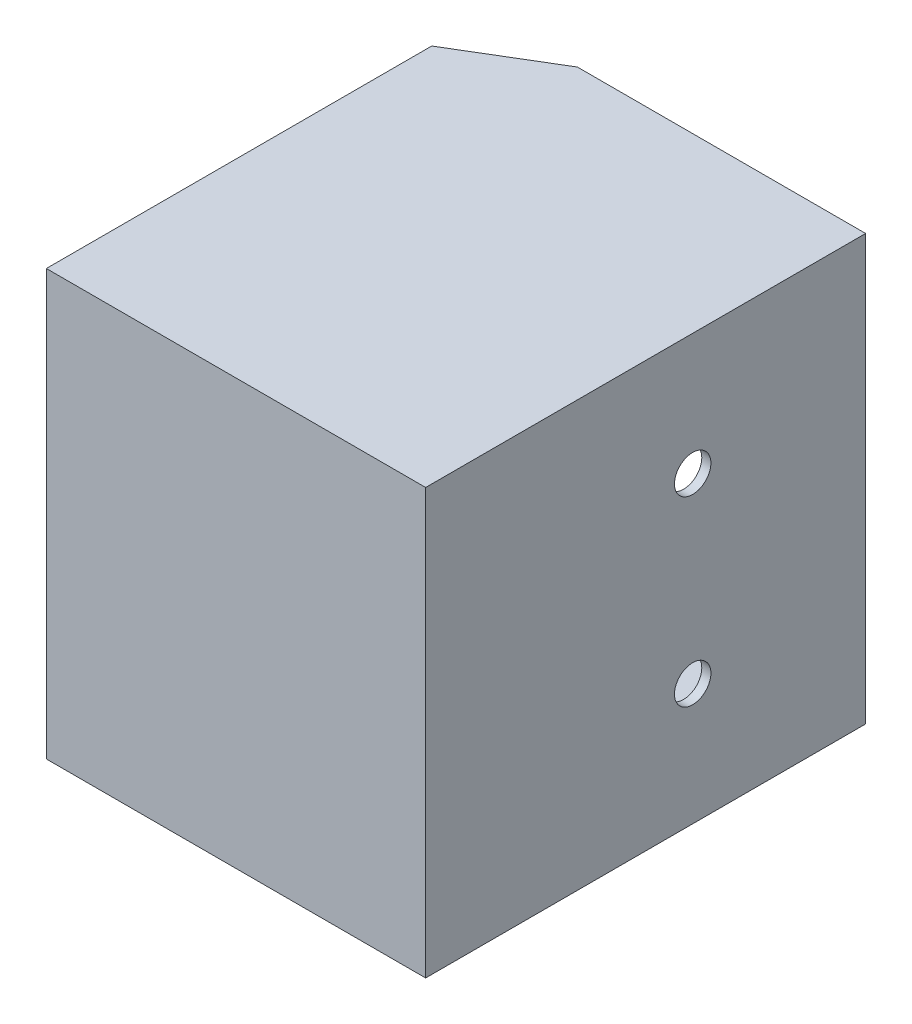
ISO-10303-21;
HEADER;
FILE_DESCRIPTION(('STEP AP214'),'2;1');
FILE_NAME('part.step','',(''),(''),'','','');
FILE_SCHEMA(('AUTOMOTIVE_DESIGN { 1 0 10303 214 1 1 1 1 }'));
ENDSEC;
DATA;
#1=APPLICATION_CONTEXT('core data for automotive mechanical design processes');
#2=APPLICATION_PROTOCOL_DEFINITION('international standard','automotive_design',2000,#1);
#3=PRODUCT_CONTEXT('',#1,'mechanical');
#4=PRODUCT('Part','Part','',(#3));
#5=PRODUCT_RELATED_PRODUCT_CATEGORY('part','',(#4));
#6=PRODUCT_DEFINITION_FORMATION('','',#4);
#7=PRODUCT_DEFINITION_CONTEXT('part definition',#1,'design');
#8=PRODUCT_DEFINITION('design','',#6,#7);
#9=PRODUCT_DEFINITION_SHAPE('','',#8);
#10=(LENGTH_UNIT() NAMED_UNIT(*) SI_UNIT(.MILLI.,.METRE.));
#11=(NAMED_UNIT(*) PLANE_ANGLE_UNIT() SI_UNIT($,.RADIAN.));
#12=(NAMED_UNIT(*) SI_UNIT($,.STERADIAN.) SOLID_ANGLE_UNIT());
#13=UNCERTAINTY_MEASURE_WITH_UNIT(LENGTH_MEASURE(1.E-05),#10,'distance_accuracy_value','');
#14=(GEOMETRIC_REPRESENTATION_CONTEXT(3) GLOBAL_UNCERTAINTY_ASSIGNED_CONTEXT((#13)) GLOBAL_UNIT_ASSIGNED_CONTEXT((#10,
#11,#12)) REPRESENTATION_CONTEXT('',''));
#15=CARTESIAN_POINT('',(0.,0.,0.));
#16=DIRECTION('',(0.,0.,1.));
#17=DIRECTION('',(1.,0.,0.));
#18=AXIS2_PLACEMENT_3D('',#15,#16,#17);
#19=CARTESIAN_POINT('',(0.,0.,127.));
#20=DIRECTION('',(0.,0.,1.));
#21=DIRECTION('',(1.,0.,0.));
#22=AXIS2_PLACEMENT_3D('',#19,#20,#21);
#23=PLANE('',#22);
#24=DIRECTION('',(1.,0.,0.));
#25=VECTOR('',#24,1.);
#26=CARTESIAN_POINT('',(0.,-67.,127.));
#27=LINE('',#26,#25);
#28=CARTESIAN_POINT('',(-52.,-67.,127.));
#29=VERTEX_POINT('',#28);
#30=CARTESIAN_POINT('',(67.,-67.,127.));
#31=VERTEX_POINT('',#30);
#32=EDGE_CURVE('E197',#29,#31,#27,.T.);
#33=ORIENTED_EDGE('',*,*,#32,.F.);
#34=DIRECTION('',(0.,1.,0.));
#35=VECTOR('',#34,1.);
#36=CARTESIAN_POINT('',(-52.,0.,127.));
#37=LINE('',#36,#35);
#38=CARTESIAN_POINT('',(-52.,67.,127.));
#39=VERTEX_POINT('',#38);
#40=EDGE_CURVE('E275',#29,#39,#37,.T.);
#41=ORIENTED_EDGE('',*,*,#40,.T.);
#42=DIRECTION('',(1.,0.,0.));
#43=VECTOR('',#42,1.);
#44=CARTESIAN_POINT('',(0.,67.,127.));
#45=LINE('',#44,#43);
#46=CARTESIAN_POINT('',(67.,67.,127.));
#47=VERTEX_POINT('',#46);
#48=EDGE_CURVE('E218',#39,#47,#45,.T.);
#49=ORIENTED_EDGE('',*,*,#48,.T.);
#50=DIRECTION('',(0.,-1.,0.));
#51=VECTOR('',#50,1.);
#52=CARTESIAN_POINT('',(67.,0.,127.));
#53=LINE('',#52,#51);
#54=EDGE_CURVE('E267',#47,#31,#53,.T.);
#55=ORIENTED_EDGE('',*,*,#54,.T.);
#56=EDGE_LOOP('',(#33,#41,#49,#55));
#57=FACE_BOUND('',#56,.T.);
#58=DIRECTION('',(0.,1.,0.));
#59=VECTOR('',#58,1.);
#60=CARTESIAN_POINT('',(-20.,0.,127.));
#61=LINE('',#60,#59);
#62=CARTESIAN_POINT('',(-20.,20.5,127.));
#63=VERTEX_POINT('',#62);
#64=CARTESIAN_POINT('',(-20.,24.5,127.));
#65=VERTEX_POINT('',#64);
#66=EDGE_CURVE('E59',#63,#65,#61,.T.);
#67=ORIENTED_EDGE('',*,*,#66,.F.);
#68=DIRECTION('',(1.,0.,0.));
#69=VECTOR('',#68,1.);
#70=CARTESIAN_POINT('',(0.,20.5,127.));
#71=LINE('',#70,#69);
#72=CARTESIAN_POINT('',(40.,20.5,127.));
#73=VERTEX_POINT('',#72);
#74=EDGE_CURVE('E180',#63,#73,#71,.T.);
#75=ORIENTED_EDGE('',*,*,#74,.T.);
#76=DIRECTION('',(0.,-1.,0.));
#77=VECTOR('',#76,1.);
#78=CARTESIAN_POINT('',(40.,0.,127.));
#79=LINE('',#78,#77);
#80=CARTESIAN_POINT('',(40.,24.5,127.));
#81=VERTEX_POINT('',#80);
#82=EDGE_CURVE('E161',#81,#73,#79,.T.);
#83=ORIENTED_EDGE('',*,*,#82,.F.);
#84=DIRECTION('',(1.,0.,0.));
#85=VECTOR('',#84,1.);
#86=CARTESIAN_POINT('',(0.,24.5,127.));
#87=LINE('',#86,#85);
#88=EDGE_CURVE('E53',#65,#81,#87,.T.);
#89=ORIENTED_EDGE('',*,*,#88,.F.);
#90=EDGE_LOOP('',(#67,#75,#83,#89));
#91=FACE_BOUND('',#90,.T.);
#92=ADVANCED_FACE('F39',(#57,#91),#23,.F.);
#93=CARTESIAN_POINT('',(67.,0.,0.));
#94=DIRECTION('',(1.,0.,0.));
#95=DIRECTION('',(0.,0.,-1.));
#96=AXIS2_PLACEMENT_3D('',#93,#94,#95);
#97=PLANE('',#96);
#98=CARTESIAN_POINT('',(67.,30.,42.));
#99=DIRECTION('',(1.,0.,0.));
#100=DIRECTION('',(0.,0.,-1.));
#101=AXIS2_PLACEMENT_3D('',#98,#99,#100);
#102=CIRCLE('',#101,6.);
#103=CARTESIAN_POINT('',(67.,30.,36.));
#104=VERTEX_POINT('',#103);
#105=EDGE_CURVE('E245',#104,#104,#102,.T.);
#106=ORIENTED_EDGE('',*,*,#105,.T.);
#107=EDGE_LOOP('',(#106));
#108=FACE_BOUND('',#107,.T.);
#109=CARTESIAN_POINT('',(67.,-30.,42.));
#110=DIRECTION('',(1.,0.,0.));
#111=DIRECTION('',(0.,0.,-1.));
#112=AXIS2_PLACEMENT_3D('',#109,#110,#111);
#113=CIRCLE('',#112,6.);
#114=CARTESIAN_POINT('',(67.,-30.,36.));
#115=VERTEX_POINT('',#114);
#116=EDGE_CURVE('E236',#115,#115,#113,.T.);
#117=ORIENTED_EDGE('',*,*,#116,.T.);
#118=EDGE_LOOP('',(#117));
#119=FACE_BOUND('',#118,.T.);
#120=DIRECTION('',(0.,0.,-1.));
#121=VECTOR('',#120,1.);
#122=CARTESIAN_POINT('',(67.,-67.,0.));
#123=LINE('',#122,#121);
#124=CARTESIAN_POINT('',(67.,-67.,-15.));
#125=VERTEX_POINT('',#124);
#126=EDGE_CURVE('E199',#31,#125,#123,.T.);
#127=ORIENTED_EDGE('',*,*,#126,.F.);
#128=ORIENTED_EDGE('',*,*,#54,.F.);
#129=DIRECTION('',(0.,0.,-1.));
#130=VECTOR('',#129,1.);
#131=CARTESIAN_POINT('',(67.,67.,0.));
#132=LINE('',#131,#130);
#133=CARTESIAN_POINT('',(67.,67.,-15.));
#134=VERTEX_POINT('',#133);
#135=EDGE_CURVE('E225',#47,#134,#132,.T.);
#136=ORIENTED_EDGE('',*,*,#135,.T.);
#137=DIRECTION('',(0.,1.,0.));
#138=VECTOR('',#137,1.);
#139=CARTESIAN_POINT('',(67.,-70.,-15.));
#140=LINE('',#139,#138);
#141=EDGE_CURVE('E249',#125,#134,#140,.T.);
#142=ORIENTED_EDGE('',*,*,#141,.F.);
#143=EDGE_LOOP('',(#127,#128,#136,#142));
#144=FACE_BOUND('',#143,.T.);
#145=ADVANCED_FACE('F307',(#108,#119,#144),#97,.F.);
#146=CARTESIAN_POINT('',(-52.,0.,0.));
#147=DIRECTION('',(1.,0.,0.));
#148=DIRECTION('',(0.,0.,-1.));
#149=AXIS2_PLACEMENT_3D('',#146,#147,#148);
#150=PLANE('',#149);
#151=ORIENTED_EDGE('',*,*,#40,.F.);
#152=DIRECTION('',(0.,0.,-1.));
#153=VECTOR('',#152,1.);
#154=CARTESIAN_POINT('',(-52.,-67.,0.));
#155=LINE('',#154,#153);
#156=CARTESIAN_POINT('',(-52.,-67.,3.));
#157=VERTEX_POINT('',#156);
#158=EDGE_CURVE('E193',#29,#157,#155,.T.);
#159=ORIENTED_EDGE('',*,*,#158,.T.);
#160=DIRECTION('',(0.,1.,0.));
#161=VECTOR('',#160,1.);
#162=CARTESIAN_POINT('',(-52.,-70.,3.));
#163=LINE('',#162,#161);
#164=CARTESIAN_POINT('',(-52.,67.,3.));
#165=VERTEX_POINT('',#164);
#166=EDGE_CURVE('E226',#157,#165,#163,.T.);
#167=ORIENTED_EDGE('',*,*,#166,.T.);
#168=DIRECTION('',(0.,0.,-1.));
#169=VECTOR('',#168,1.);
#170=CARTESIAN_POINT('',(-52.,67.,0.));
#171=LINE('',#170,#169);
#172=EDGE_CURVE('E216',#39,#165,#171,.T.);
#173=ORIENTED_EDGE('',*,*,#172,.F.);
#174=EDGE_LOOP('',(#151,#159,#167,#173));
#175=FACE_BOUND('',#174,.T.);
#176=ADVANCED_FACE('F314',(#175),#150,.T.);
#177=CARTESIAN_POINT('',(-52.,-70.,3.));
#178=DIRECTION('',(0.,0.,1.));
#179=DIRECTION('',(1.,0.,0.));
#180=AXIS2_PLACEMENT_3D('',#177,#178,#179);
#181=PLANE('',#180);
#182=DIRECTION('',(1.,0.,0.));
#183=VECTOR('',#182,1.);
#184=CARTESIAN_POINT('',(-52.,-67.,3.));
#185=LINE('',#184,#183);
#186=CARTESIAN_POINT('',(-55.,-67.,3.));
#187=VERTEX_POINT('',#186);
#188=EDGE_CURVE('E11',#187,#157,#185,.T.);
#189=ORIENTED_EDGE('',*,*,#188,.F.);
#190=DIRECTION('',(0.,1.,0.));
#191=VECTOR('',#190,1.);
#192=CARTESIAN_POINT('',(-55.,-70.,3.));
#193=LINE('',#192,#191);
#194=CARTESIAN_POINT('',(-55.,67.,3.));
#195=VERTEX_POINT('',#194);
#196=EDGE_CURVE('E223',#187,#195,#193,.T.);
#197=ORIENTED_EDGE('',*,*,#196,.T.);
#198=DIRECTION('',(1.,0.,0.));
#199=VECTOR('',#198,1.);
#200=CARTESIAN_POINT('',(-52.,67.,3.));
#201=LINE('',#200,#199);
#202=EDGE_CURVE('E50',#195,#165,#201,.T.);
#203=ORIENTED_EDGE('',*,*,#202,.T.);
#204=ORIENTED_EDGE('',*,*,#166,.F.);
#205=EDGE_LOOP('',(#189,#197,#203,#204));
#206=FACE_BOUND('',#205,.T.);
#207=ADVANCED_FACE('F277',(#206),#181,.F.);
#208=CARTESIAN_POINT('',(70.,0.,0.));
#209=DIRECTION('',(1.,0.,0.));
#210=DIRECTION('',(0.,0.,-1.));
#211=AXIS2_PLACEMENT_3D('',#208,#209,#210);
#212=PLANE('',#211);
#213=DIRECTION('',(0.,1.,0.));
#214=VECTOR('',#213,1.);
#215=CARTESIAN_POINT('',(70.,-70.,-15.));
#216=LINE('',#215,#214);
#217=CARTESIAN_POINT('',(70.,-70.,-15.));
#218=VERTEX_POINT('',#217);
#219=CARTESIAN_POINT('',(70.,70.,-15.));
#220=VERTEX_POINT('',#219);
#221=EDGE_CURVE('E251',#218,#220,#216,.T.);
#222=ORIENTED_EDGE('',*,*,#221,.T.);
#223=DIRECTION('',(0.,0.,1.));
#224=VECTOR('',#223,1.);
#225=CARTESIAN_POINT('',(70.,70.,-15.));
#226=LINE('',#225,#224);
#227=CARTESIAN_POINT('',(70.,70.,130.));
#228=VERTEX_POINT('',#227);
#229=EDGE_CURVE('E254',#220,#228,#226,.T.);
#230=ORIENTED_EDGE('',*,*,#229,.T.);
#231=DIRECTION('',(0.,-1.,0.));
#232=VECTOR('',#231,1.);
#233=CARTESIAN_POINT('',(70.,70.,130.));
#234=LINE('',#233,#232);
#235=CARTESIAN_POINT('',(70.,-70.,130.));
#236=VERTEX_POINT('',#235);
#237=EDGE_CURVE('E260',#228,#236,#234,.T.);
#238=ORIENTED_EDGE('',*,*,#237,.T.);
#239=DIRECTION('',(0.,0.,-1.));
#240=VECTOR('',#239,1.);
#241=CARTESIAN_POINT('',(70.,-70.,130.));
#242=LINE('',#241,#240);
#243=EDGE_CURVE('E253',#236,#218,#242,.T.);
#244=ORIENTED_EDGE('',*,*,#243,.T.);
#245=EDGE_LOOP('',(#222,#230,#238,#244));
#246=FACE_BOUND('',#245,.T.);
#247=CARTESIAN_POINT('',(70.,30.,42.));
#248=DIRECTION('',(1.,0.,0.));
#249=DIRECTION('',(0.,0.,-1.));
#250=AXIS2_PLACEMENT_3D('',#247,#248,#249);
#251=CIRCLE('',#250,6.);
#252=CARTESIAN_POINT('',(70.,30.,36.));
#253=VERTEX_POINT('',#252);
#254=EDGE_CURVE('E244',#253,#253,#251,.T.);
#255=ORIENTED_EDGE('',*,*,#254,.F.);
#256=EDGE_LOOP('',(#255));
#257=FACE_BOUND('',#256,.T.);
#258=CARTESIAN_POINT('',(70.,-30.,42.));
#259=DIRECTION('',(1.,0.,0.));
#260=DIRECTION('',(0.,0.,-1.));
#261=AXIS2_PLACEMENT_3D('',#258,#259,#260);
#262=CIRCLE('',#261,6.);
#263=CARTESIAN_POINT('',(70.,-30.,36.));
#264=VERTEX_POINT('',#263);
#265=EDGE_CURVE('E239',#264,#264,#262,.T.);
#266=ORIENTED_EDGE('',*,*,#265,.F.);
#267=EDGE_LOOP('',(#266));
#268=FACE_BOUND('',#267,.T.);
#269=ADVANCED_FACE('F321',(#246,#257,#268),#212,.T.);
#270=CARTESIAN_POINT('',(70.,-70.,130.));
#271=DIRECTION('',(0.,1.,0.));
#272=DIRECTION('',(0.,0.,1.));
#273=AXIS2_PLACEMENT_3D('',#270,#271,#272);
#274=PLANE('',#273);
#275=DIRECTION('',(0.,0.,-1.));
#276=VECTOR('',#275,1.);
#277=CARTESIAN_POINT('',(-55.,-70.,130.));
#278=LINE('',#277,#276);
#279=CARTESIAN_POINT('',(-55.,-70.,130.));
#280=VERTEX_POINT('',#279);
#281=CARTESIAN_POINT('',(-55.,-70.,3.));
#282=VERTEX_POINT('',#281);
#283=EDGE_CURVE('E237',#280,#282,#278,.T.);
#284=ORIENTED_EDGE('',*,*,#283,.T.);
#285=DIRECTION('',(-0.857492925712544,0.,0.514495755427526));
#286=VECTOR('',#285,1.);
#287=CARTESIAN_POINT('',(-55.,-70.,3.));
#288=LINE('',#287,#286);
#289=CARTESIAN_POINT('',(-25.,-70.,-15.));
#290=VERTEX_POINT('',#289);
#291=EDGE_CURVE('E181',#290,#282,#288,.T.);
#292=ORIENTED_EDGE('',*,*,#291,.F.);
#293=DIRECTION('',(-1.,0.,0.));
#294=VECTOR('',#293,1.);
#295=CARTESIAN_POINT('',(70.,-70.,-15.));
#296=LINE('',#295,#294);
#297=EDGE_CURVE('E270',#218,#290,#296,.T.);
#298=ORIENTED_EDGE('',*,*,#297,.F.);
#299=ORIENTED_EDGE('',*,*,#243,.F.);
#300=DIRECTION('',(-1.,0.,0.));
#301=VECTOR('',#300,1.);
#302=CARTESIAN_POINT('',(70.,-70.,130.));
#303=LINE('',#302,#301);
#304=EDGE_CURVE('E259',#236,#280,#303,.T.);
#305=ORIENTED_EDGE('',*,*,#304,.T.);
#306=EDGE_LOOP('',(#284,#292,#298,#299,#305));
#307=FACE_BOUND('',#306,.T.);
#308=ADVANCED_FACE('F41',(#307),#274,.F.);
#309=CARTESIAN_POINT('',(70.,-70.,-15.));
#310=DIRECTION('',(0.,0.,1.));
#311=DIRECTION('',(1.,0.,0.));
#312=AXIS2_PLACEMENT_3D('',#309,#310,#311);
#313=PLANE('',#312);
#314=DIRECTION('',(-1.,0.,0.));
#315=VECTOR('',#314,1.);
#316=CARTESIAN_POINT('',(70.,70.,-15.));
#317=LINE('',#316,#315);
#318=CARTESIAN_POINT('',(-25.,70.,-15.));
#319=VERTEX_POINT('',#318);
#320=EDGE_CURVE('E264',#220,#319,#317,.T.);
#321=ORIENTED_EDGE('',*,*,#320,.F.);
#322=ORIENTED_EDGE('',*,*,#221,.F.);
#323=ORIENTED_EDGE('',*,*,#297,.T.);
#324=DIRECTION('',(0.,-1.,0.));
#325=VECTOR('',#324,1.);
#326=CARTESIAN_POINT('',(-25.,-67.,-15.));
#327=LINE('',#326,#325);
#328=CARTESIAN_POINT('',(-25.,-67.,-15.));
#329=VERTEX_POINT('',#328);
#330=EDGE_CURVE('E188',#329,#290,#327,.T.);
#331=ORIENTED_EDGE('',*,*,#330,.F.);
#332=DIRECTION('',(-1.,0.,0.));
#333=VECTOR('',#332,1.);
#334=CARTESIAN_POINT('',(-25.,-67.,-15.));
#335=LINE('',#334,#333);
#336=EDGE_CURVE('E190',#125,#329,#335,.T.);
#337=ORIENTED_EDGE('',*,*,#336,.F.);
#338=ORIENTED_EDGE('',*,*,#141,.T.);
#339=DIRECTION('',(-1.,0.,0.));
#340=VECTOR('',#339,1.);
#341=CARTESIAN_POINT('',(-25.,67.,-15.));
#342=LINE('',#341,#340);
#343=CARTESIAN_POINT('',(-25.,67.,-15.));
#344=VERTEX_POINT('',#343);
#345=EDGE_CURVE('E210',#134,#344,#342,.T.);
#346=ORIENTED_EDGE('',*,*,#345,.T.);
#347=DIRECTION('',(0.,-1.,0.));
#348=VECTOR('',#347,1.);
#349=CARTESIAN_POINT('',(-25.,70.,-15.));
#350=LINE('',#349,#348);
#351=EDGE_CURVE('E206',#319,#344,#350,.T.);
#352=ORIENTED_EDGE('',*,*,#351,.F.);
#353=EDGE_LOOP('',(#321,#322,#323,#331,#337,#338,#346,#352));
#354=FACE_BOUND('',#353,.T.);
#355=ADVANCED_FACE('F304',(#354),#313,.F.);
#356=CARTESIAN_POINT('',(70.,70.,-15.));
#357=DIRECTION('',(0.,-1.,0.));
#358=DIRECTION('',(0.,0.,-1.));
#359=AXIS2_PLACEMENT_3D('',#356,#357,#358);
#360=PLANE('',#359);
#361=DIRECTION('',(-0.857492925712544,0.,0.514495755427526));
#362=VECTOR('',#361,1.);
#363=CARTESIAN_POINT('',(-55.,70.,3.));
#364=LINE('',#363,#362);
#365=CARTESIAN_POINT('',(-55.,70.,3.));
#366=VERTEX_POINT('',#365);
#367=EDGE_CURVE('E204',#319,#366,#364,.T.);
#368=ORIENTED_EDGE('',*,*,#367,.T.);
#369=DIRECTION('',(0.,0.,-1.));
#370=VECTOR('',#369,1.);
#371=CARTESIAN_POINT('',(-55.,70.,130.));
#372=LINE('',#371,#370);
#373=CARTESIAN_POINT('',(-55.,70.,130.));
#374=VERTEX_POINT('',#373);
#375=EDGE_CURVE('E234',#374,#366,#372,.T.);
#376=ORIENTED_EDGE('',*,*,#375,.F.);
#377=DIRECTION('',(-1.,0.,0.));
#378=VECTOR('',#377,1.);
#379=CARTESIAN_POINT('',(70.,70.,130.));
#380=LINE('',#379,#378);
#381=EDGE_CURVE('E263',#228,#374,#380,.T.);
#382=ORIENTED_EDGE('',*,*,#381,.F.);
#383=ORIENTED_EDGE('',*,*,#229,.F.);
#384=ORIENTED_EDGE('',*,*,#320,.T.);
#385=EDGE_LOOP('',(#368,#376,#382,#383,#384));
#386=FACE_BOUND('',#385,.T.);
#387=ADVANCED_FACE('F300',(#386),#360,.F.);
#388=CARTESIAN_POINT('',(70.,70.,130.));
#389=DIRECTION('',(0.,0.,-1.));
#390=DIRECTION('',(-1.,0.,0.));
#391=AXIS2_PLACEMENT_3D('',#388,#389,#390);
#392=PLANE('',#391);
#393=DIRECTION('',(0.,-1.,0.));
#394=VECTOR('',#393,1.);
#395=CARTESIAN_POINT('',(-55.,70.,130.));
#396=LINE('',#395,#394);
#397=EDGE_CURVE('E227',#374,#280,#396,.T.);
#398=ORIENTED_EDGE('',*,*,#397,.T.);
#399=ORIENTED_EDGE('',*,*,#304,.F.);
#400=ORIENTED_EDGE('',*,*,#237,.F.);
#401=ORIENTED_EDGE('',*,*,#381,.T.);
#402=EDGE_LOOP('',(#398,#399,#400,#401));
#403=FACE_BOUND('',#402,.T.);
#404=ADVANCED_FACE('F342',(#403),#392,.F.);
#405=CARTESIAN_POINT('',(70.,30.,42.));
#406=DIRECTION('',(-1.,0.,0.));
#407=DIRECTION('',(0.,0.,1.));
#408=AXIS2_PLACEMENT_3D('',#405,#406,#407);
#409=CYLINDRICAL_SURFACE('',#408,6.);
#410=ORIENTED_EDGE('',*,*,#254,.T.);
#411=EDGE_LOOP('',(#410));
#412=FACE_BOUND('',#411,.T.);
#413=ORIENTED_EDGE('',*,*,#105,.F.);
#414=EDGE_LOOP('',(#413));
#415=FACE_BOUND('',#414,.T.);
#416=ADVANCED_FACE('F337',(#412,#415),#409,.F.);
#417=CARTESIAN_POINT('',(70.,-30.,42.));
#418=DIRECTION('',(-1.,0.,0.));
#419=DIRECTION('',(0.,0.,1.));
#420=AXIS2_PLACEMENT_3D('',#417,#418,#419);
#421=CYLINDRICAL_SURFACE('',#420,6.);
#422=ORIENTED_EDGE('',*,*,#265,.T.);
#423=EDGE_LOOP('',(#422));
#424=FACE_BOUND('',#423,.T.);
#425=ORIENTED_EDGE('',*,*,#116,.F.);
#426=EDGE_LOOP('',(#425));
#427=FACE_BOUND('',#426,.T.);
#428=ADVANCED_FACE('F333',(#424,#427),#421,.F.);
#429=CARTESIAN_POINT('',(-55.,70.,130.));
#430=DIRECTION('',(1.,0.,0.));
#431=DIRECTION('',(0.,0.,-1.));
#432=AXIS2_PLACEMENT_3D('',#429,#430,#431);
#433=PLANE('',#432);
#434=ORIENTED_EDGE('',*,*,#196,.F.);
#435=EDGE_CURVE('E228',#282,#187,#193,.T.);
#436=ORIENTED_EDGE('',*,*,#435,.F.);
#437=ORIENTED_EDGE('',*,*,#283,.F.);
#438=ORIENTED_EDGE('',*,*,#397,.F.);
#439=ORIENTED_EDGE('',*,*,#375,.T.);
#440=DIRECTION('',(0.,-1.,0.));
#441=VECTOR('',#440,1.);
#442=CARTESIAN_POINT('',(-55.,70.,3.));
#443=LINE('',#442,#441);
#444=EDGE_CURVE('E213',#366,#195,#443,.T.);
#445=ORIENTED_EDGE('',*,*,#444,.T.);
#446=EDGE_LOOP('',(#434,#436,#437,#438,#439,#445));
#447=FACE_BOUND('',#446,.T.);
#448=ADVANCED_FACE('F290',(#447),#433,.F.);
#449=CARTESIAN_POINT('',(0.,67.,0.));
#450=DIRECTION('',(0.,-1.,0.));
#451=DIRECTION('',(0.,0.,-1.));
#452=AXIS2_PLACEMENT_3D('',#449,#450,#451);
#453=PLANE('',#452);
#454=ORIENTED_EDGE('',*,*,#135,.F.);
#455=ORIENTED_EDGE('',*,*,#48,.F.);
#456=ORIENTED_EDGE('',*,*,#172,.T.);
#457=ORIENTED_EDGE('',*,*,#202,.F.);
#458=DIRECTION('',(-0.857492925712544,0.,0.514495755427526));
#459=VECTOR('',#458,1.);
#460=CARTESIAN_POINT('',(-55.,67.,3.));
#461=LINE('',#460,#459);
#462=EDGE_CURVE('E201',#344,#195,#461,.T.);
#463=ORIENTED_EDGE('',*,*,#462,.F.);
#464=ORIENTED_EDGE('',*,*,#345,.F.);
#465=EDGE_LOOP('',(#454,#455,#456,#457,#463,#464));
#466=FACE_BOUND('',#465,.T.);
#467=ADVANCED_FACE('F278',(#466),#453,.T.);
#468=CARTESIAN_POINT('',(-55.,70.,3.));
#469=DIRECTION('',(0.514495755427526,0.,0.857492925712544));
#470=DIRECTION('',(0.857492925712544,0.,-0.514495755427526));
#471=AXIS2_PLACEMENT_3D('',#468,#469,#470);
#472=PLANE('',#471);
#473=ORIENTED_EDGE('',*,*,#462,.T.);
#474=ORIENTED_EDGE('',*,*,#444,.F.);
#475=ORIENTED_EDGE('',*,*,#367,.F.);
#476=ORIENTED_EDGE('',*,*,#351,.T.);
#477=EDGE_LOOP('',(#473,#474,#475,#476));
#478=FACE_BOUND('',#477,.T.);
#479=ADVANCED_FACE('F286',(#478),#472,.F.);
#480=CARTESIAN_POINT('',(0.,-67.,0.));
#481=DIRECTION('',(0.,-1.,0.));
#482=DIRECTION('',(0.,0.,-1.));
#483=AXIS2_PLACEMENT_3D('',#480,#481,#482);
#484=PLANE('',#483);
#485=ORIENTED_EDGE('',*,*,#32,.T.);
#486=ORIENTED_EDGE('',*,*,#126,.T.);
#487=ORIENTED_EDGE('',*,*,#336,.T.);
#488=DIRECTION('',(-0.857492925712544,0.,0.514495755427526));
#489=VECTOR('',#488,1.);
#490=CARTESIAN_POINT('',(-55.,-67.,3.));
#491=LINE('',#490,#489);
#492=EDGE_CURVE('E184',#329,#187,#491,.T.);
#493=ORIENTED_EDGE('',*,*,#492,.T.);
#494=ORIENTED_EDGE('',*,*,#188,.T.);
#495=ORIENTED_EDGE('',*,*,#158,.F.);
#496=EDGE_LOOP('',(#485,#486,#487,#493,#494,#495));
#497=FACE_BOUND('',#496,.T.);
#498=ADVANCED_FACE('F315',(#497),#484,.F.);
#499=CARTESIAN_POINT('',(-55.,-67.,3.));
#500=DIRECTION('',(0.514495755427526,0.,0.857492925712544));
#501=DIRECTION('',(0.857492925712544,0.,-0.514495755427526));
#502=AXIS2_PLACEMENT_3D('',#499,#500,#501);
#503=PLANE('',#502);
#504=ORIENTED_EDGE('',*,*,#291,.T.);
#505=ORIENTED_EDGE('',*,*,#435,.T.);
#506=ORIENTED_EDGE('',*,*,#492,.F.);
#507=ORIENTED_EDGE('',*,*,#330,.T.);
#508=EDGE_LOOP('',(#504,#505,#506,#507));
#509=FACE_BOUND('',#508,.T.);
#510=ADVANCED_FACE('F361',(#509),#503,.F.);
#511=CARTESIAN_POINT('',(0.,24.5,0.));
#512=DIRECTION('',(0.,-1.,0.));
#513=DIRECTION('',(0.,0.,-1.));
#514=AXIS2_PLACEMENT_3D('',#511,#512,#513);
#515=PLANE('',#514);
#516=CARTESIAN_POINT('',(0.,24.5,0.));
#517=DIRECTION('',(0.,1.,0.));
#518=DIRECTION('',(0.,0.,1.));
#519=AXIS2_PLACEMENT_3D('',#516,#517,#518);
#520=CIRCLE('',#519,2.);
#521=CARTESIAN_POINT('',(0.,24.5,2.));
#522=VERTEX_POINT('',#521);
#523=EDGE_CURVE('E173',#522,#522,#520,.T.);
#524=ORIENTED_EDGE('',*,*,#523,.F.);
#525=EDGE_LOOP('',(#524));
#526=FACE_BOUND('',#525,.T.);
#527=DIRECTION('',(0.,0.,1.));
#528=VECTOR('',#527,1.);
#529=CARTESIAN_POINT('',(-20.,24.5,130.));
#530=LINE('',#529,#528);
#531=CARTESIAN_POINT('',(-20.,24.5,-12.));
#532=VERTEX_POINT('',#531);
#533=EDGE_CURVE('E155',#532,#65,#530,.T.);
#534=ORIENTED_EDGE('',*,*,#533,.T.);
#535=ORIENTED_EDGE('',*,*,#88,.T.);
#536=DIRECTION('',(0.,0.,-1.));
#537=VECTOR('',#536,1.);
#538=CARTESIAN_POINT('',(40.,24.5,-12.));
#539=LINE('',#538,#537);
#540=CARTESIAN_POINT('',(40.,24.5,-12.));
#541=VERTEX_POINT('',#540);
#542=EDGE_CURVE('E141',#81,#541,#539,.T.);
#543=ORIENTED_EDGE('',*,*,#542,.T.);
#544=DIRECTION('',(-1.,0.,0.));
#545=VECTOR('',#544,1.);
#546=CARTESIAN_POINT('',(-20.,24.5,-12.));
#547=LINE('',#546,#545);
#548=EDGE_CURVE('E146',#541,#532,#547,.T.);
#549=ORIENTED_EDGE('',*,*,#548,.T.);
#550=EDGE_LOOP('',(#534,#535,#543,#549));
#551=FACE_BOUND('',#550,.T.);
#552=ADVANCED_FACE('F148',(#526,#551),#515,.F.);
#553=CARTESIAN_POINT('',(0.,20.5,0.));
#554=DIRECTION('',(0.,-1.,0.));
#555=DIRECTION('',(0.,0.,-1.));
#556=AXIS2_PLACEMENT_3D('',#553,#554,#555);
#557=PLANE('',#556);
#558=CARTESIAN_POINT('',(0.,20.5,0.));
#559=DIRECTION('',(0.,1.,0.));
#560=DIRECTION('',(0.,0.,1.));
#561=AXIS2_PLACEMENT_3D('',#558,#559,#560);
#562=CIRCLE('',#561,2.);
#563=CARTESIAN_POINT('',(0.,20.5,2.));
#564=VERTEX_POINT('',#563);
#565=EDGE_CURVE('E488',#564,#564,#562,.T.);
#566=ORIENTED_EDGE('',*,*,#565,.T.);
#567=EDGE_LOOP('',(#566));
#568=FACE_BOUND('',#567,.T.);
#569=ORIENTED_EDGE('',*,*,#74,.F.);
#570=DIRECTION('',(0.,0.,1.));
#571=VECTOR('',#570,1.);
#572=CARTESIAN_POINT('',(-20.,20.5,130.));
#573=LINE('',#572,#571);
#574=CARTESIAN_POINT('',(-20.,20.5,-12.));
#575=VERTEX_POINT('',#574);
#576=EDGE_CURVE('E171',#575,#63,#573,.T.);
#577=ORIENTED_EDGE('',*,*,#576,.F.);
#578=DIRECTION('',(-1.,0.,0.));
#579=VECTOR('',#578,1.);
#580=CARTESIAN_POINT('',(-20.,20.5,-12.));
#581=LINE('',#580,#579);
#582=CARTESIAN_POINT('',(40.,20.5,-12.));
#583=VERTEX_POINT('',#582);
#584=EDGE_CURVE('E176',#583,#575,#581,.T.);
#585=ORIENTED_EDGE('',*,*,#584,.F.);
#586=DIRECTION('',(0.,0.,-1.));
#587=VECTOR('',#586,1.);
#588=CARTESIAN_POINT('',(40.,20.5,-12.));
#589=LINE('',#588,#587);
#590=EDGE_CURVE('E158',#73,#583,#589,.T.);
#591=ORIENTED_EDGE('',*,*,#590,.F.);
#592=EDGE_LOOP('',(#569,#577,#585,#591));
#593=FACE_BOUND('',#592,.T.);
#594=ADVANCED_FACE('F377',(#568,#593),#557,.T.);
#595=CARTESIAN_POINT('',(-20.,24.5,130.));
#596=DIRECTION('',(1.,0.,0.));
#597=DIRECTION('',(0.,0.,-1.));
#598=AXIS2_PLACEMENT_3D('',#595,#596,#597);
#599=PLANE('',#598);
#600=ORIENTED_EDGE('',*,*,#576,.T.);
#601=ORIENTED_EDGE('',*,*,#66,.T.);
#602=ORIENTED_EDGE('',*,*,#533,.F.);
#603=DIRECTION('',(0.,-1.,0.));
#604=VECTOR('',#603,1.);
#605=CARTESIAN_POINT('',(-20.,24.5,-12.));
#606=LINE('',#605,#604);
#607=EDGE_CURVE('E165',#532,#575,#606,.T.);
#608=ORIENTED_EDGE('',*,*,#607,.T.);
#609=EDGE_LOOP('',(#600,#601,#602,#608));
#610=FACE_BOUND('',#609,.T.);
#611=ADVANCED_FACE('F443',(#610),#599,.F.);
#612=CARTESIAN_POINT('',(40.,24.5,-12.));
#613=DIRECTION('',(-1.,0.,0.));
#614=DIRECTION('',(0.,0.,1.));
#615=AXIS2_PLACEMENT_3D('',#612,#613,#614);
#616=PLANE('',#615);
#617=ORIENTED_EDGE('',*,*,#542,.F.);
#618=ORIENTED_EDGE('',*,*,#82,.T.);
#619=ORIENTED_EDGE('',*,*,#590,.T.);
#620=DIRECTION('',(0.,-1.,0.));
#621=VECTOR('',#620,1.);
#622=CARTESIAN_POINT('',(40.,24.5,-12.));
#623=LINE('',#622,#621);
#624=EDGE_CURVE('E154',#541,#583,#623,.T.);
#625=ORIENTED_EDGE('',*,*,#624,.F.);
#626=EDGE_LOOP('',(#617,#618,#619,#625));
#627=FACE_BOUND('',#626,.T.);
#628=ADVANCED_FACE('F156',(#627),#616,.F.);
#629=CARTESIAN_POINT('',(-20.,24.5,-12.));
#630=DIRECTION('',(0.,0.,1.));
#631=DIRECTION('',(1.,0.,0.));
#632=AXIS2_PLACEMENT_3D('',#629,#630,#631);
#633=PLANE('',#632);
#634=ORIENTED_EDGE('',*,*,#584,.T.);
#635=ORIENTED_EDGE('',*,*,#607,.F.);
#636=ORIENTED_EDGE('',*,*,#548,.F.);
#637=ORIENTED_EDGE('',*,*,#624,.T.);
#638=EDGE_LOOP('',(#634,#635,#636,#637));
#639=FACE_BOUND('',#638,.T.);
#640=ADVANCED_FACE('F163',(#639),#633,.F.);
#641=CARTESIAN_POINT('',(0.,24.5,0.));
#642=DIRECTION('',(0.,-1.,0.));
#643=DIRECTION('',(0.,0.,-1.));
#644=AXIS2_PLACEMENT_3D('',#641,#642,#643);
#645=CYLINDRICAL_SURFACE('',#644,2.);
#646=ORIENTED_EDGE('',*,*,#523,.T.);
#647=EDGE_LOOP('',(#646));
#648=FACE_BOUND('',#647,.T.);
#649=ORIENTED_EDGE('',*,*,#565,.F.);
#650=EDGE_LOOP('',(#649));
#651=FACE_BOUND('',#650,.T.);
#652=ADVANCED_FACE('F473',(#648,#651),#645,.F.);
#653=CLOSED_SHELL('',(#92,#145,#176,#207,#269,#308,#355,#387,#404,#416,#428,#448,#467,#479,#498,
#510,#552,#594,#611,#628,#640,#652));
#654=MANIFOLD_SOLID_BREP('B2',#653);
#655=ADVANCED_BREP_SHAPE_REPRESENTATION('',(#18,#654),#14);
#656=SHAPE_DEFINITION_REPRESENTATION(#9,#655);
ENDSEC;
END-ISO-10303-21;
